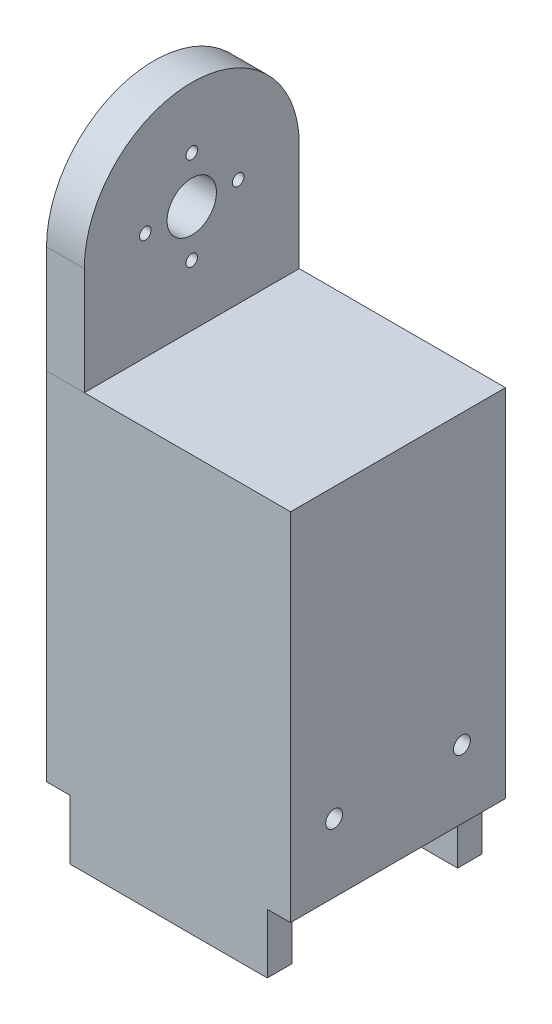
ISO-10303-21;
HEADER;
FILE_DESCRIPTION(('STEP AP214'),'2;1');
FILE_NAME('part.step','',(''),(''),'','','');
FILE_SCHEMA(('AUTOMOTIVE_DESIGN { 1 0 10303 214 1 1 1 1 }'));
ENDSEC;
DATA;
#1=APPLICATION_CONTEXT('core data for automotive mechanical design processes');
#2=APPLICATION_PROTOCOL_DEFINITION('international standard','automotive_design',2000,#1);
#3=PRODUCT_CONTEXT('',#1,'mechanical');
#4=PRODUCT('Part','Part','',(#3));
#5=PRODUCT_RELATED_PRODUCT_CATEGORY('part','',(#4));
#6=PRODUCT_DEFINITION_FORMATION('','',#4);
#7=PRODUCT_DEFINITION_CONTEXT('part definition',#1,'design');
#8=PRODUCT_DEFINITION('design','',#6,#7);
#9=PRODUCT_DEFINITION_SHAPE('','',#8);
#10=(LENGTH_UNIT() NAMED_UNIT(*) SI_UNIT(.MILLI.,.METRE.));
#11=(NAMED_UNIT(*) PLANE_ANGLE_UNIT() SI_UNIT($,.RADIAN.));
#12=(NAMED_UNIT(*) SI_UNIT($,.STERADIAN.) SOLID_ANGLE_UNIT());
#13=UNCERTAINTY_MEASURE_WITH_UNIT(LENGTH_MEASURE(1.E-05),#10,'distance_accuracy_value','');
#14=(GEOMETRIC_REPRESENTATION_CONTEXT(3) GLOBAL_UNCERTAINTY_ASSIGNED_CONTEXT((#13)) GLOBAL_UNIT_ASSIGNED_CONTEXT((#10,
#11,#12)) REPRESENTATION_CONTEXT('',''));
#15=CARTESIAN_POINT('',(0.,0.,0.));
#16=DIRECTION('',(0.,0.,1.));
#17=DIRECTION('',(1.,0.,0.));
#18=AXIS2_PLACEMENT_3D('',#15,#16,#17);
#19=CARTESIAN_POINT('',(-5.22083765373738,75.7060374898499,55.1424805889509));
#20=DIRECTION('',(1.,0.,0.));
#21=DIRECTION('',(0.,1.,0.));
#22=AXIS2_PLACEMENT_3D('',#19,#20,#21);
#23=CYLINDRICAL_SURFACE('',#22,1.);
#24=CARTESIAN_POINT('',(3.77916234626259,75.7060374898499,55.1424805889509));
#25=DIRECTION('',(1.,0.,0.));
#26=DIRECTION('',(0.,0.,-1.));
#27=AXIS2_PLACEMENT_3D('',#24,#25,#26);
#28=CIRCLE('',#27,1.);
#29=CARTESIAN_POINT('',(3.77916234626259,75.7060374898499,54.1424805889509));
#30=VERTEX_POINT('',#29);
#31=EDGE_CURVE('P0_E79',#30,#30,#28,.F.);
#32=ORIENTED_EDGE('',*,*,#31,.T.);
#33=EDGE_LOOP('',(#32));
#34=FACE_BOUND('',#33,.T.);
#35=CARTESIAN_POINT('',(10.2791623462627,75.7060374898499,55.1424805889509));
#36=DIRECTION('',(1.,0.,0.));
#37=DIRECTION('',(0.,1.,0.));
#38=AXIS2_PLACEMENT_3D('',#35,#36,#37);
#39=CIRCLE('',#38,1.);
#40=CARTESIAN_POINT('',(10.2791623462627,76.7060374898499,55.1424805889509));
#41=VERTEX_POINT('',#40);
#42=EDGE_CURVE('P0_E115',#41,#41,#39,.F.);
#43=ORIENTED_EDGE('',*,*,#42,.F.);
#44=EDGE_LOOP('',(#43));
#45=FACE_BOUND('',#44,.T.);
#46=ADVANCED_FACE('P0_F17',(#34,#45),#23,.F.);
#47=CARTESIAN_POINT('',(-5.22083765373738,59.7060374898499,55.1424805889507));
#48=DIRECTION('',(1.,0.,0.));
#49=DIRECTION('',(0.,1.,0.));
#50=AXIS2_PLACEMENT_3D('',#47,#48,#49);
#51=CYLINDRICAL_SURFACE('',#50,1.);
#52=CARTESIAN_POINT('',(3.77916234626259,59.7060374898499,55.1424805889507));
#53=DIRECTION('',(1.,0.,0.));
#54=DIRECTION('',(0.,0.,-1.));
#55=AXIS2_PLACEMENT_3D('',#52,#53,#54);
#56=CIRCLE('',#55,1.);
#57=CARTESIAN_POINT('',(3.77916234626259,59.7060374898499,54.1424805889507));
#58=VERTEX_POINT('',#57);
#59=EDGE_CURVE('P0_E89',#58,#58,#56,.F.);
#60=ORIENTED_EDGE('',*,*,#59,.T.);
#61=EDGE_LOOP('',(#60));
#62=FACE_BOUND('',#61,.T.);
#63=CARTESIAN_POINT('',(10.2791623462627,59.7060374898499,55.1424805889507));
#64=DIRECTION('',(1.,0.,0.));
#65=DIRECTION('',(0.,1.,0.));
#66=AXIS2_PLACEMENT_3D('',#63,#64,#65);
#67=CIRCLE('',#66,1.);
#68=CARTESIAN_POINT('',(10.2791623462627,60.7060374898499,55.1424805889507));
#69=VERTEX_POINT('',#68);
#70=EDGE_CURVE('P0_E112',#69,#69,#67,.F.);
#71=ORIENTED_EDGE('',*,*,#70,.F.);
#72=EDGE_LOOP('',(#71));
#73=FACE_BOUND('',#72,.T.);
#74=ADVANCED_FACE('P0_F19',(#62,#73),#51,.F.);
#75=CARTESIAN_POINT('',(-5.22083765373738,67.7060374898499,63.1424805889508));
#76=DIRECTION('',(1.,0.,0.));
#77=DIRECTION('',(0.,1.,0.));
#78=AXIS2_PLACEMENT_3D('',#75,#76,#77);
#79=CYLINDRICAL_SURFACE('',#78,1.);
#80=CARTESIAN_POINT('',(3.77916234626259,67.7060374898499,63.1424805889508));
#81=DIRECTION('',(1.,0.,0.));
#82=DIRECTION('',(0.,0.,-1.));
#83=AXIS2_PLACEMENT_3D('',#80,#81,#82);
#84=CIRCLE('',#83,1.);
#85=CARTESIAN_POINT('',(3.77916234626259,67.7060374898499,62.1424805889508));
#86=VERTEX_POINT('',#85);
#87=EDGE_CURVE('P0_E92',#86,#86,#84,.F.);
#88=ORIENTED_EDGE('',*,*,#87,.T.);
#89=EDGE_LOOP('',(#88));
#90=FACE_BOUND('',#89,.T.);
#91=CARTESIAN_POINT('',(10.2791623462627,67.7060374898499,63.1424805889508));
#92=DIRECTION('',(1.,0.,0.));
#93=DIRECTION('',(0.,1.,0.));
#94=AXIS2_PLACEMENT_3D('',#91,#92,#93);
#95=CIRCLE('',#94,1.);
#96=CARTESIAN_POINT('',(10.2791623462627,68.7060374898499,63.1424805889508));
#97=VERTEX_POINT('',#96);
#98=EDGE_CURVE('P0_E109',#97,#97,#95,.F.);
#99=ORIENTED_EDGE('',*,*,#98,.F.);
#100=EDGE_LOOP('',(#99));
#101=FACE_BOUND('',#100,.T.);
#102=ADVANCED_FACE('P0_F128',(#90,#101),#79,.F.);
#103=CARTESIAN_POINT('',(-5.22083765373738,67.7060374898499,55.1424805889509));
#104=DIRECTION('',(1.,0.,0.));
#105=DIRECTION('',(0.,1.,0.));
#106=AXIS2_PLACEMENT_3D('',#103,#104,#105);
#107=CYLINDRICAL_SURFACE('',#106,4.25);
#108=CARTESIAN_POINT('',(3.77916234626259,67.7060374898499,55.1424805889509));
#109=DIRECTION('',(1.,0.,0.));
#110=DIRECTION('',(0.,0.,-1.));
#111=AXIS2_PLACEMENT_3D('',#108,#109,#110);
#112=CIRCLE('',#111,4.25);
#113=CARTESIAN_POINT('',(3.77916234626259,67.7060374898499,50.8924805889509));
#114=VERTEX_POINT('',#113);
#115=EDGE_CURVE('P0_E75',#114,#114,#112,.F.);
#116=ORIENTED_EDGE('',*,*,#115,.T.);
#117=EDGE_LOOP('',(#116));
#118=FACE_BOUND('',#117,.T.);
#119=CARTESIAN_POINT('',(10.2791623462627,67.7060374898499,55.1424805889509));
#120=DIRECTION('',(1.,0.,0.));
#121=DIRECTION('',(0.,1.,0.));
#122=AXIS2_PLACEMENT_3D('',#119,#120,#121);
#123=CIRCLE('',#122,4.25);
#124=CARTESIAN_POINT('',(10.2791623462627,71.9560374898499,55.1424805889509));
#125=VERTEX_POINT('',#124);
#126=EDGE_CURVE('P0_E106',#125,#125,#123,.F.);
#127=ORIENTED_EDGE('',*,*,#126,.F.);
#128=EDGE_LOOP('',(#127));
#129=FACE_BOUND('',#128,.T.);
#130=ADVANCED_FACE('P0_F137',(#118,#129),#107,.F.);
#131=CARTESIAN_POINT('',(-5.22083765373738,67.70603748985,47.1424805889508));
#132=DIRECTION('',(1.,0.,0.));
#133=DIRECTION('',(0.,1.,0.));
#134=AXIS2_PLACEMENT_3D('',#131,#132,#133);
#135=CYLINDRICAL_SURFACE('',#134,1.);
#136=CARTESIAN_POINT('',(3.77916234626259,67.70603748985,47.1424805889508));
#137=DIRECTION('',(1.,0.,0.));
#138=DIRECTION('',(0.,0.,-1.));
#139=AXIS2_PLACEMENT_3D('',#136,#137,#138);
#140=CIRCLE('',#139,1.);
#141=CARTESIAN_POINT('',(3.77916234626259,67.70603748985,46.1424805889508));
#142=VERTEX_POINT('',#141);
#143=EDGE_CURVE('P0_E86',#142,#142,#140,.F.);
#144=ORIENTED_EDGE('',*,*,#143,.T.);
#145=EDGE_LOOP('',(#144));
#146=FACE_BOUND('',#145,.T.);
#147=CARTESIAN_POINT('',(10.2791623462627,67.70603748985,47.1424805889508));
#148=DIRECTION('',(1.,0.,0.));
#149=DIRECTION('',(0.,1.,0.));
#150=AXIS2_PLACEMENT_3D('',#147,#148,#149);
#151=CIRCLE('',#150,1.);
#152=CARTESIAN_POINT('',(10.2791623462627,68.70603748985,47.1424805889508));
#153=VERTEX_POINT('',#152);
#154=EDGE_CURVE('P0_E103',#153,#153,#151,.F.);
#155=ORIENTED_EDGE('',*,*,#154,.F.);
#156=EDGE_LOOP('',(#155));
#157=FACE_BOUND('',#156,.T.);
#158=ADVANCED_FACE('P0_F134',(#146,#157),#135,.F.);
#159=CARTESIAN_POINT('',(-0.220837653737416,67.7060374898499,55.1424805889509));
#160=DIRECTION('',(1.,0.,0.));
#161=DIRECTION('',(0.,1.,0.));
#162=AXIS2_PLACEMENT_3D('',#159,#160,#161);
#163=CYLINDRICAL_SURFACE('',#162,18.5);
#164=DIRECTION('',(1.,0.,0.));
#165=VECTOR('',#164,1.);
#166=CARTESIAN_POINT('',(-0.220837653737416,67.7060374898499,36.6424805889509));
#167=LINE('',#166,#165);
#168=CARTESIAN_POINT('',(3.77916234626259,67.7060374898499,36.6424805889509));
#169=VERTEX_POINT('',#168);
#170=CARTESIAN_POINT('',(10.2791623462627,67.7060374898499,36.6424805889509));
#171=VERTEX_POINT('',#170);
#172=EDGE_CURVE('P0_E21',#169,#171,#167,.T.);
#173=ORIENTED_EDGE('',*,*,#172,.F.);
#174=CARTESIAN_POINT('',(3.77916234626259,67.7060374898499,55.1424805889509));
#175=DIRECTION('',(1.,0.,0.));
#176=DIRECTION('',(0.,0.,-1.));
#177=AXIS2_PLACEMENT_3D('',#174,#175,#176);
#178=CIRCLE('',#177,18.5);
#179=CARTESIAN_POINT('',(3.77916234626259,67.7060374898499,73.6424805889509));
#180=VERTEX_POINT('',#179);
#181=EDGE_CURVE('P0_E76',#180,#169,#178,.F.);
#182=ORIENTED_EDGE('',*,*,#181,.F.);
#183=DIRECTION('',(1.,0.,0.));
#184=VECTOR('',#183,1.);
#185=CARTESIAN_POINT('',(-0.220837653737416,67.7060374898499,73.6424805889509));
#186=LINE('',#185,#184);
#187=CARTESIAN_POINT('',(10.2791623462627,67.7060374898499,73.6424805889509));
#188=VERTEX_POINT('',#187);
#189=EDGE_CURVE('P0_E11',#180,#188,#186,.T.);
#190=ORIENTED_EDGE('',*,*,#189,.T.);
#191=CARTESIAN_POINT('',(10.2791623462627,67.7060374898499,55.1424805889509));
#192=DIRECTION('',(1.,0.,0.));
#193=DIRECTION('',(0.,1.,0.));
#194=AXIS2_PLACEMENT_3D('',#191,#192,#193);
#195=CIRCLE('',#194,18.5);
#196=EDGE_CURVE('P0_E95',#171,#188,#195,.T.);
#197=ORIENTED_EDGE('',*,*,#196,.F.);
#198=EDGE_LOOP('',(#173,#182,#190,#197));
#199=FACE_BOUND('',#198,.T.);
#200=ADVANCED_FACE('P0_F132',(#199),#163,.T.);
#201=CARTESIAN_POINT('',(3.77916234626259,-67.0439625101501,27.6424805889509));
#202=DIRECTION('',(1.,0.,0.));
#203=DIRECTION('',(0.,0.,-1.));
#204=AXIS2_PLACEMENT_3D('',#201,#202,#203);
#205=PLANE('',#204);
#206=ORIENTED_EDGE('',*,*,#87,.F.);
#207=EDGE_LOOP('',(#206));
#208=FACE_BOUND('',#207,.T.);
#209=ORIENTED_EDGE('',*,*,#143,.F.);
#210=EDGE_LOOP('',(#209));
#211=FACE_BOUND('',#210,.T.);
#212=ORIENTED_EDGE('',*,*,#115,.F.);
#213=EDGE_LOOP('',(#212));
#214=FACE_BOUND('',#213,.T.);
#215=ORIENTED_EDGE('',*,*,#31,.F.);
#216=EDGE_LOOP('',(#215));
#217=FACE_BOUND('',#216,.T.);
#218=ORIENTED_EDGE('',*,*,#59,.F.);
#219=EDGE_LOOP('',(#218));
#220=FACE_BOUND('',#219,.T.);
#221=DIRECTION('',(0.,1.,0.));
#222=VECTOR('',#221,1.);
#223=CARTESIAN_POINT('',(3.77916234626259,92.70603748985,36.6424805889509));
#224=LINE('',#223,#222);
#225=CARTESIAN_POINT('',(3.77916234626259,49.20603748985,36.6424805889509));
#226=VERTEX_POINT('',#225);
#227=EDGE_CURVE('P0_E71',#226,#169,#224,.T.);
#228=ORIENTED_EDGE('',*,*,#227,.F.);
#229=DIRECTION('',(0.,0.,-1.));
#230=VECTOR('',#229,1.);
#231=CARTESIAN_POINT('',(3.77916234626259,49.20603748985,36.6424805889509));
#232=LINE('',#231,#230);
#233=CARTESIAN_POINT('',(3.77916234626259,49.20603748985,73.6424805889509));
#234=VERTEX_POINT('',#233);
#235=EDGE_CURVE('P0_E58',#234,#226,#232,.T.);
#236=ORIENTED_EDGE('',*,*,#235,.F.);
#237=DIRECTION('',(0.,1.,0.));
#238=VECTOR('',#237,1.);
#239=CARTESIAN_POINT('',(3.77916234626259,92.70603748985,73.6424805889509));
#240=LINE('',#239,#238);
#241=EDGE_CURVE('P0_E69',#234,#180,#240,.T.);
#242=ORIENTED_EDGE('',*,*,#241,.T.);
#243=ORIENTED_EDGE('',*,*,#181,.T.);
#244=EDGE_LOOP('',(#228,#236,#242,#243));
#245=FACE_BOUND('',#244,.T.);
#246=ADVANCED_FACE('P0_F67',(#208,#211,#214,#217,#220,#245),#205,.F.);
#247=CARTESIAN_POINT('',(10.2791623462627,92.70603748985,82.6424805889509));
#248=DIRECTION('',(1.,0.,0.));
#249=DIRECTION('',(0.,1.,0.));
#250=AXIS2_PLACEMENT_3D('',#247,#248,#249);
#251=PLANE('',#250);
#252=ORIENTED_EDGE('',*,*,#196,.T.);
#253=DIRECTION('',(0.,-1.,0.));
#254=VECTOR('',#253,1.);
#255=CARTESIAN_POINT('',(10.2791623462627,92.70603748985,73.6424805889509));
#256=LINE('',#255,#254);
#257=CARTESIAN_POINT('',(10.2791623462626,49.20603748985,73.6424805889509));
#258=VERTEX_POINT('',#257);
#259=EDGE_CURVE('P0_E98',#188,#258,#256,.T.);
#260=ORIENTED_EDGE('',*,*,#259,.T.);
#261=DIRECTION('',(0.,0.,-1.));
#262=VECTOR('',#261,1.);
#263=CARTESIAN_POINT('',(10.2791623462627,49.20603748985,82.6424805889509));
#264=LINE('',#263,#262);
#265=CARTESIAN_POINT('',(10.2791623462627,49.20603748985,36.6424805889509));
#266=VERTEX_POINT('',#265);
#267=EDGE_CURVE('P0_E59',#258,#266,#264,.T.);
#268=ORIENTED_EDGE('',*,*,#267,.T.);
#269=DIRECTION('',(0.,1.,0.));
#270=VECTOR('',#269,1.);
#271=CARTESIAN_POINT('',(10.2791623462627,92.70603748985,36.6424805889509));
#272=LINE('',#271,#270);
#273=EDGE_CURVE('P0_E101',#266,#171,#272,.T.);
#274=ORIENTED_EDGE('',*,*,#273,.T.);
#275=EDGE_LOOP('',(#252,#260,#268,#274));
#276=FACE_BOUND('',#275,.T.);
#277=ORIENTED_EDGE('',*,*,#154,.T.);
#278=EDGE_LOOP('',(#277));
#279=FACE_BOUND('',#278,.T.);
#280=ORIENTED_EDGE('',*,*,#126,.T.);
#281=EDGE_LOOP('',(#280));
#282=FACE_BOUND('',#281,.T.);
#283=ORIENTED_EDGE('',*,*,#98,.T.);
#284=EDGE_LOOP('',(#283));
#285=FACE_BOUND('',#284,.T.);
#286=ORIENTED_EDGE('',*,*,#70,.T.);
#287=EDGE_LOOP('',(#286));
#288=FACE_BOUND('',#287,.T.);
#289=ORIENTED_EDGE('',*,*,#42,.T.);
#290=EDGE_LOOP('',(#289));
#291=FACE_BOUND('',#290,.T.);
#292=ADVANCED_FACE('P0_F119',(#276,#279,#282,#285,#288,#291),#251,.T.);
#293=CARTESIAN_POINT('',(-0.220837653737416,92.70603748985,36.6424805889509));
#294=DIRECTION('',(0.,0.,1.));
#295=DIRECTION('',(1.,0.,0.));
#296=AXIS2_PLACEMENT_3D('',#293,#294,#295);
#297=PLANE('',#296);
#298=ORIENTED_EDGE('',*,*,#273,.F.);
#299=DIRECTION('',(-1.,0.,0.));
#300=VECTOR('',#299,1.);
#301=CARTESIAN_POINT('',(45.7791623462626,49.20603748985,36.6424805889509));
#302=LINE('',#301,#300);
#303=EDGE_CURVE('P0_E39',#266,#226,#302,.T.);
#304=ORIENTED_EDGE('',*,*,#303,.T.);
#305=ORIENTED_EDGE('',*,*,#227,.T.);
#306=ORIENTED_EDGE('',*,*,#172,.T.);
#307=EDGE_LOOP('',(#298,#304,#305,#306));
#308=FACE_BOUND('',#307,.T.);
#309=ADVANCED_FACE('P0_F151',(#308),#297,.F.);
#310=CARTESIAN_POINT('',(-0.220837653737416,92.70603748985,73.6424805889509));
#311=DIRECTION('',(0.,0.,1.));
#312=DIRECTION('',(1.,0.,0.));
#313=AXIS2_PLACEMENT_3D('',#310,#311,#312);
#314=PLANE('',#313);
#315=DIRECTION('',(-1.,0.,0.));
#316=VECTOR('',#315,1.);
#317=CARTESIAN_POINT('',(45.7791623462626,49.20603748985,73.6424805889509));
#318=LINE('',#317,#316);
#319=EDGE_CURVE('P0_E55',#258,#234,#318,.T.);
#320=ORIENTED_EDGE('',*,*,#319,.F.);
#321=ORIENTED_EDGE('',*,*,#259,.F.);
#322=ORIENTED_EDGE('',*,*,#189,.F.);
#323=ORIENTED_EDGE('',*,*,#241,.F.);
#324=EDGE_LOOP('',(#320,#321,#322,#323));
#325=FACE_BOUND('',#324,.T.);
#326=ADVANCED_FACE('P0_F74',(#325),#314,.T.);
#327=CARTESIAN_POINT('',(45.7791623462626,49.20603748985,36.6424805889509));
#328=DIRECTION('',(0.,1.,0.));
#329=DIRECTION('',(0.,0.,1.));
#330=AXIS2_PLACEMENT_3D('',#327,#328,#329);
#331=PLANE('',#330);
#332=ORIENTED_EDGE('',*,*,#319,.T.);
#333=ORIENTED_EDGE('',*,*,#235,.T.);
#334=ORIENTED_EDGE('',*,*,#303,.F.);
#335=ORIENTED_EDGE('',*,*,#267,.F.);
#336=EDGE_LOOP('',(#332,#333,#334,#335));
#337=FACE_BOUND('',#336,.T.);
#338=ADVANCED_FACE('P0_F57',(#337),#331,.F.);
#339=CLOSED_SHELL('',(#46,#74,#102,#130,#158,#200,#246,#292,#309,#326,#338));
#340=MANIFOLD_SOLID_BREP('P0_B1',#339);
#341=CARTESIAN_POINT('',(7.77916234626263,147.70603748985,27.6424805889509));
#342=DIRECTION('',(1.,0.,0.));
#343=DIRECTION('',(0.,1.,0.));
#344=AXIS2_PLACEMENT_3D('',#341,#342,#343);
#345=PLANE('',#344);
#346=DIRECTION('',(0.,0.,1.));
#347=VECTOR('',#346,1.);
#348=CARTESIAN_POINT('',(7.77916234626261,2.95603748984996,27.6424805889509));
#349=LINE('',#348,#347);
#350=CARTESIAN_POINT('',(7.77916234626259,2.95603748984996,40.8924805889509));
#351=VERTEX_POINT('',#350);
#352=CARTESIAN_POINT('',(7.77916234626261,2.95603748984996,69.3924805889509));
#353=VERTEX_POINT('',#352);
#354=EDGE_CURVE('P1_E270',#351,#353,#349,.T.);
#355=ORIENTED_EDGE('',*,*,#354,.T.);
#356=DIRECTION('',(0.,1.,0.));
#357=VECTOR('',#356,1.);
#358=CARTESIAN_POINT('',(7.77916234626261,-22.0439625101501,69.3924805889509));
#359=LINE('',#358,#357);
#360=CARTESIAN_POINT('',(7.77916234626259,-12.0439625101501,69.3924805889509));
#361=VERTEX_POINT('',#360);
#362=EDGE_CURVE('P1_E286',#361,#353,#359,.T.);
#363=ORIENTED_EDGE('',*,*,#362,.F.);
#364=DIRECTION('',(0.,0.,1.));
#365=VECTOR('',#364,1.);
#366=CARTESIAN_POINT('',(7.77916234626259,-12.0439625101501,27.6424805889509));
#367=LINE('',#366,#365);
#368=CARTESIAN_POINT('',(7.77916234626259,-12.0439625101501,40.8924805889509));
#369=VERTEX_POINT('',#368);
#370=EDGE_CURVE('P1_E246',#369,#361,#367,.T.);
#371=ORIENTED_EDGE('',*,*,#370,.F.);
#372=DIRECTION('',(0.,1.,0.));
#373=VECTOR('',#372,1.);
#374=CARTESIAN_POINT('',(7.77916234626261,-22.0439625101501,40.8924805889509));
#375=LINE('',#374,#373);
#376=EDGE_CURVE('P1_E263',#369,#351,#375,.T.);
#377=ORIENTED_EDGE('',*,*,#376,.T.);
#378=EDGE_LOOP('',(#355,#363,#371,#377));
#379=FACE_BOUND('',#378,.T.);
#380=CARTESIAN_POINT('',(7.7791623462626,-0.293962510150042,66.1424805889509));
#381=DIRECTION('',(1.,0.,0.));
#382=DIRECTION('',(0.,0.,-1.));
#383=AXIS2_PLACEMENT_3D('',#380,#381,#382);
#384=CIRCLE('',#383,1.45);
#385=CARTESIAN_POINT('',(7.7791623462626,-0.293962510150042,64.6924805889509));
#386=VERTEX_POINT('',#385);
#387=EDGE_CURVE('P1_E167',#386,#386,#384,.T.);
#388=ORIENTED_EDGE('',*,*,#387,.F.);
#389=EDGE_LOOP('',(#388));
#390=FACE_BOUND('',#389,.T.);
#391=CARTESIAN_POINT('',(7.7791623462626,-0.293962510150042,44.1424805889509));
#392=DIRECTION('',(1.,0.,0.));
#393=DIRECTION('',(0.,0.,-1.));
#394=AXIS2_PLACEMENT_3D('',#391,#392,#393);
#395=CIRCLE('',#394,1.45);
#396=CARTESIAN_POINT('',(7.7791623462626,-0.293962510150042,42.6924805889509));
#397=VERTEX_POINT('',#396);
#398=EDGE_CURVE('P1_E176',#397,#397,#395,.T.);
#399=ORIENTED_EDGE('',*,*,#398,.F.);
#400=EDGE_LOOP('',(#399));
#401=FACE_BOUND('',#400,.T.);
#402=ADVANCED_FACE('P1_F17',(#379,#390,#401),#345,.T.);
#403=CARTESIAN_POINT('',(24.7791623462626,2.95603748984996,27.6424805889509));
#404=DIRECTION('',(0.,1.,0.));
#405=DIRECTION('',(0.,0.,1.));
#406=AXIS2_PLACEMENT_3D('',#403,#404,#405);
#407=PLANE('',#406);
#408=DIRECTION('',(-1.,0.,0.));
#409=VECTOR('',#408,1.);
#410=CARTESIAN_POINT('',(7.77916234626261,2.95603748984996,40.8924805889509));
#411=LINE('',#410,#409);
#412=CARTESIAN_POINT('',(41.7791623462626,2.95603748984996,40.8924805889509));
#413=VERTEX_POINT('',#412);
#414=EDGE_CURVE('P1_E294',#413,#351,#411,.T.);
#415=ORIENTED_EDGE('',*,*,#414,.F.);
#416=DIRECTION('',(0.,0.,1.));
#417=VECTOR('',#416,1.);
#418=CARTESIAN_POINT('',(41.7791623462626,2.95603748984996,27.6424805889509));
#419=LINE('',#418,#417);
#420=CARTESIAN_POINT('',(41.7791623462626,2.95603748984996,69.3924805889509));
#421=VERTEX_POINT('',#420);
#422=EDGE_CURVE('P1_E269',#413,#421,#419,.T.);
#423=ORIENTED_EDGE('',*,*,#422,.T.);
#424=DIRECTION('',(1.,0.,0.));
#425=VECTOR('',#424,1.);
#426=CARTESIAN_POINT('',(7.77916234626261,2.95603748984996,69.3924805889509));
#427=LINE('',#426,#425);
#428=EDGE_CURVE('P1_E163',#353,#421,#427,.T.);
#429=ORIENTED_EDGE('',*,*,#428,.F.);
#430=ORIENTED_EDGE('',*,*,#354,.F.);
#431=EDGE_LOOP('',(#415,#423,#429,#430));
#432=FACE_BOUND('',#431,.T.);
#433=ADVANCED_FACE('P1_F310',(#432),#407,.F.);
#434=CARTESIAN_POINT('',(41.7791623462626,147.70603748985,27.6424805889509));
#435=DIRECTION('',(1.,0.,0.));
#436=DIRECTION('',(0.,0.,-1.));
#437=AXIS2_PLACEMENT_3D('',#434,#435,#436);
#438=PLANE('',#437);
#439=DIRECTION('',(0.,1.,0.));
#440=VECTOR('',#439,1.);
#441=CARTESIAN_POINT('',(41.7791623462626,-22.0439625101501,69.3924805889509));
#442=LINE('',#441,#440);
#443=CARTESIAN_POINT('',(41.7791623462626,-12.0439625101501,69.3924805889509));
#444=VERTEX_POINT('',#443);
#445=EDGE_CURVE('P1_E276',#444,#421,#442,.T.);
#446=ORIENTED_EDGE('',*,*,#445,.T.);
#447=ORIENTED_EDGE('',*,*,#422,.F.);
#448=DIRECTION('',(0.,1.,0.));
#449=VECTOR('',#448,1.);
#450=CARTESIAN_POINT('',(41.7791623462626,-22.0439625101501,40.8924805889509));
#451=LINE('',#450,#449);
#452=CARTESIAN_POINT('',(41.7791623462626,-12.0439625101501,40.8924805889509));
#453=VERTEX_POINT('',#452);
#454=EDGE_CURVE('P1_E291',#453,#413,#451,.T.);
#455=ORIENTED_EDGE('',*,*,#454,.F.);
#456=DIRECTION('',(0.,0.,1.));
#457=VECTOR('',#456,1.);
#458=CARTESIAN_POINT('',(41.7791623462626,-12.0439625101501,27.6424805889509));
#459=LINE('',#458,#457);
#460=EDGE_CURVE('P1_E159',#453,#444,#459,.T.);
#461=ORIENTED_EDGE('',*,*,#460,.T.);
#462=EDGE_LOOP('',(#446,#447,#455,#461));
#463=FACE_BOUND('',#462,.T.);
#464=CARTESIAN_POINT('',(41.7791623462626,-0.293962510150042,66.1424805889509));
#465=DIRECTION('',(1.,0.,0.));
#466=DIRECTION('',(0.,0.,-1.));
#467=AXIS2_PLACEMENT_3D('',#464,#465,#466);
#468=CIRCLE('',#467,1.45);
#469=CARTESIAN_POINT('',(41.7791623462626,-0.293962510150042,64.6924805889509));
#470=VERTEX_POINT('',#469);
#471=EDGE_CURVE('P1_E154',#470,#470,#468,.T.);
#472=ORIENTED_EDGE('',*,*,#471,.T.);
#473=EDGE_LOOP('',(#472));
#474=FACE_BOUND('',#473,.T.);
#475=CARTESIAN_POINT('',(41.7791623462626,-0.293962510150042,44.1424805889509));
#476=DIRECTION('',(1.,0.,0.));
#477=DIRECTION('',(0.,0.,-1.));
#478=AXIS2_PLACEMENT_3D('',#475,#476,#477);
#479=CIRCLE('',#478,1.45);
#480=CARTESIAN_POINT('',(41.7791623462626,-0.293962510150042,42.6924805889509));
#481=VERTEX_POINT('',#480);
#482=EDGE_CURVE('P1_E158',#481,#481,#479,.T.);
#483=ORIENTED_EDGE('',*,*,#482,.T.);
#484=EDGE_LOOP('',(#483));
#485=FACE_BOUND('',#484,.T.);
#486=ADVANCED_FACE('P1_F316',(#463,#474,#485),#438,.F.);
#487=CARTESIAN_POINT('',(7.77916234626261,-22.0439625101501,69.3924805889509));
#488=DIRECTION('',(0.,0.,1.));
#489=DIRECTION('',(1.,0.,0.));
#490=AXIS2_PLACEMENT_3D('',#487,#488,#489);
#491=PLANE('',#490);
#492=ORIENTED_EDGE('',*,*,#428,.T.);
#493=ORIENTED_EDGE('',*,*,#445,.F.);
#494=CARTESIAN_POINT('',(41.7791623462626,-22.2939625101501,69.3924805889509));
#495=VERTEX_POINT('',#494);
#496=EDGE_CURVE('P1_E287',#495,#444,#442,.T.);
#497=ORIENTED_EDGE('',*,*,#496,.F.);
#498=DIRECTION('',(1.,0.,0.));
#499=VECTOR('',#498,1.);
#500=CARTESIAN_POINT('',(24.7791623462626,-22.2939625101501,69.3924805889509));
#501=LINE('',#500,#499);
#502=CARTESIAN_POINT('',(7.77916234626259,-22.2939625101501,69.3924805889509));
#503=VERTEX_POINT('',#502);
#504=EDGE_CURVE('P1_E249',#503,#495,#501,.T.);
#505=ORIENTED_EDGE('',*,*,#504,.F.);
#506=EDGE_CURVE('P1_E282',#503,#361,#359,.T.);
#507=ORIENTED_EDGE('',*,*,#506,.T.);
#508=ORIENTED_EDGE('',*,*,#362,.T.);
#509=EDGE_LOOP('',(#492,#493,#497,#505,#507,#508));
#510=FACE_BOUND('',#509,.T.);
#511=ADVANCED_FACE('P1_F306',(#510),#491,.F.);
#512=CARTESIAN_POINT('',(7.77916234626261,-22.0439625101501,40.8924805889509));
#513=DIRECTION('',(0.,0.,-1.));
#514=DIRECTION('',(-1.,0.,0.));
#515=AXIS2_PLACEMENT_3D('',#512,#513,#514);
#516=PLANE('',#515);
#517=ORIENTED_EDGE('',*,*,#414,.T.);
#518=ORIENTED_EDGE('',*,*,#376,.F.);
#519=CARTESIAN_POINT('',(7.77916234626259,-22.2939625101501,40.8924805889509));
#520=VERTEX_POINT('',#519);
#521=EDGE_CURVE('P1_E222',#520,#369,#375,.T.);
#522=ORIENTED_EDGE('',*,*,#521,.F.);
#523=DIRECTION('',(1.,0.,0.));
#524=VECTOR('',#523,1.);
#525=CARTESIAN_POINT('',(24.7791623462626,-22.2939625101501,40.8924805889509));
#526=LINE('',#525,#524);
#527=CARTESIAN_POINT('',(41.7791623462626,-22.2939625101501,40.8924805889509));
#528=VERTEX_POINT('',#527);
#529=EDGE_CURVE('P1_E296',#520,#528,#526,.T.);
#530=ORIENTED_EDGE('',*,*,#529,.T.);
#531=EDGE_CURVE('P1_E302',#528,#453,#451,.T.);
#532=ORIENTED_EDGE('',*,*,#531,.T.);
#533=ORIENTED_EDGE('',*,*,#454,.T.);
#534=EDGE_LOOP('',(#517,#518,#522,#530,#532,#533));
#535=FACE_BOUND('',#534,.T.);
#536=ADVANCED_FACE('P1_F332',(#535),#516,.F.);
#537=CARTESIAN_POINT('',(41.7791623462626,147.70603748985,82.6424805889509));
#538=DIRECTION('',(1.,0.,0.));
#539=DIRECTION('',(0.,1.,0.));
#540=AXIS2_PLACEMENT_3D('',#537,#538,#539);
#541=PLANE('',#540);
#542=DIRECTION('',(0.,1.,0.));
#543=VECTOR('',#542,1.);
#544=CARTESIAN_POINT('',(41.7791623462626,147.70603748985,73.6424805889509));
#545=LINE('',#544,#543);
#546=CARTESIAN_POINT('',(41.7791623462626,-22.2939625101501,73.6424805889509));
#547=VERTEX_POINT('',#546);
#548=CARTESIAN_POINT('',(41.7791623462626,-12.0439625101501,73.6424805889509));
#549=VERTEX_POINT('',#548);
#550=EDGE_CURVE('P1_E151',#547,#549,#545,.T.);
#551=ORIENTED_EDGE('',*,*,#550,.F.);
#552=DIRECTION('',(0.,0.,1.));
#553=VECTOR('',#552,1.);
#554=CARTESIAN_POINT('',(41.7791623462626,-22.2939625101501,69.3924805889509));
#555=LINE('',#554,#553);
#556=EDGE_CURVE('P1_E255',#495,#547,#555,.T.);
#557=ORIENTED_EDGE('',*,*,#556,.F.);
#558=ORIENTED_EDGE('',*,*,#496,.T.);
#559=EDGE_CURVE('P1_E290',#444,#549,#459,.T.);
#560=ORIENTED_EDGE('',*,*,#559,.T.);
#561=EDGE_LOOP('',(#551,#557,#558,#560));
#562=FACE_BOUND('',#561,.T.);
#563=ADVANCED_FACE('P1_F326',(#562),#541,.T.);
#564=DIRECTION('',(0.,-1.,0.));
#565=VECTOR('',#564,1.);
#566=CARTESIAN_POINT('',(41.7791623462626,147.70603748985,36.6424805889509));
#567=LINE('',#566,#565);
#568=CARTESIAN_POINT('',(41.7791623462626,-12.0439625101501,36.6424805889509));
#569=VERTEX_POINT('',#568);
#570=CARTESIAN_POINT('',(41.7791623462626,-22.2939625101501,36.6424805889509));
#571=VERTEX_POINT('',#570);
#572=EDGE_CURVE('P1_E204',#569,#571,#567,.T.);
#573=ORIENTED_EDGE('',*,*,#572,.F.);
#574=EDGE_CURVE('P1_E321',#569,#453,#459,.T.);
#575=ORIENTED_EDGE('',*,*,#574,.T.);
#576=ORIENTED_EDGE('',*,*,#531,.F.);
#577=DIRECTION('',(0.,0.,-1.));
#578=VECTOR('',#577,1.);
#579=CARTESIAN_POINT('',(41.7791623462626,-22.2939625101501,40.8924805889509));
#580=LINE('',#579,#578);
#581=EDGE_CURVE('P1_E229',#528,#571,#580,.T.);
#582=ORIENTED_EDGE('',*,*,#581,.T.);
#583=EDGE_LOOP('',(#573,#575,#576,#582));
#584=FACE_BOUND('',#583,.T.);
#585=ADVANCED_FACE('P1_F340',(#584),#541,.T.);
#586=CARTESIAN_POINT('',(41.7791623462626,-12.0439625101501,27.6424805889509));
#587=DIRECTION('',(0.,1.,0.));
#588=DIRECTION('',(-1.,0.,0.));
#589=AXIS2_PLACEMENT_3D('',#586,#587,#588);
#590=PLANE('',#589);
#591=DIRECTION('',(0.,0.,1.));
#592=VECTOR('',#591,1.);
#593=CARTESIAN_POINT('',(45.7791623462626,-12.0439625101501,27.6424805889509));
#594=LINE('',#593,#592);
#595=CARTESIAN_POINT('',(45.7791623462626,-12.0439625101501,36.6424805889509));
#596=VERTEX_POINT('',#595);
#597=CARTESIAN_POINT('',(45.7791623462626,-12.0439625101501,73.6424805889509));
#598=VERTEX_POINT('',#597);
#599=EDGE_CURVE('P1_E224',#596,#598,#594,.T.);
#600=ORIENTED_EDGE('',*,*,#599,.T.);
#601=DIRECTION('',(-1.,0.,0.));
#602=VECTOR('',#601,1.);
#603=CARTESIAN_POINT('',(41.7791623462626,-12.0439625101501,73.6424805889509));
#604=LINE('',#603,#602);
#605=EDGE_CURVE('P1_E136',#598,#549,#604,.T.);
#606=ORIENTED_EDGE('',*,*,#605,.T.);
#607=ORIENTED_EDGE('',*,*,#559,.F.);
#608=ORIENTED_EDGE('',*,*,#460,.F.);
#609=ORIENTED_EDGE('',*,*,#574,.F.);
#610=DIRECTION('',(1.,0.,0.));
#611=VECTOR('',#610,1.);
#612=CARTESIAN_POINT('',(41.7791623462626,-12.0439625101501,36.6424805889509));
#613=LINE('',#612,#611);
#614=EDGE_CURVE('P1_E213',#569,#596,#613,.T.);
#615=ORIENTED_EDGE('',*,*,#614,.T.);
#616=EDGE_LOOP('',(#600,#606,#607,#608,#609,#615));
#617=FACE_BOUND('',#616,.T.);
#618=ADVANCED_FACE('P1_F329',(#617),#590,.F.);
#619=CARTESIAN_POINT('',(7.77916234626265,147.70603748985,82.6424805889509));
#620=DIRECTION('',(-1.,0.,0.));
#621=DIRECTION('',(0.,1.,0.));
#622=AXIS2_PLACEMENT_3D('',#619,#620,#621);
#623=PLANE('',#622);
#624=DIRECTION('',(0.,-1.,0.));
#625=VECTOR('',#624,1.);
#626=CARTESIAN_POINT('',(7.77916234626265,147.70603748985,73.6424805889509));
#627=LINE('',#626,#625);
#628=CARTESIAN_POINT('',(7.77916234626259,-12.0439625101501,73.6424805889509));
#629=VERTEX_POINT('',#628);
#630=CARTESIAN_POINT('',(7.77916234626259,-22.2939625101501,73.6424805889509));
#631=VERTEX_POINT('',#630);
#632=EDGE_CURVE('P1_E152',#629,#631,#627,.T.);
#633=ORIENTED_EDGE('',*,*,#632,.F.);
#634=EDGE_CURVE('P1_E241',#361,#629,#367,.T.);
#635=ORIENTED_EDGE('',*,*,#634,.F.);
#636=ORIENTED_EDGE('',*,*,#506,.F.);
#637=DIRECTION('',(0.,0.,1.));
#638=VECTOR('',#637,1.);
#639=CARTESIAN_POINT('',(7.77916234626259,-22.2939625101501,69.3924805889509));
#640=LINE('',#639,#638);
#641=EDGE_CURVE('P1_E216',#503,#631,#640,.T.);
#642=ORIENTED_EDGE('',*,*,#641,.T.);
#643=EDGE_LOOP('',(#633,#635,#636,#642));
#644=FACE_BOUND('',#643,.T.);
#645=ADVANCED_FACE('P1_F240',(#644),#623,.T.);
#646=DIRECTION('',(0.,1.,0.));
#647=VECTOR('',#646,1.);
#648=CARTESIAN_POINT('',(7.77916234626265,147.70603748985,36.6424805889509));
#649=LINE('',#648,#647);
#650=CARTESIAN_POINT('',(7.77916234626259,-22.2939625101501,36.6424805889509));
#651=VERTEX_POINT('',#650);
#652=CARTESIAN_POINT('',(7.77916234626259,-12.0439625101501,36.6424805889509));
#653=VERTEX_POINT('',#652);
#654=EDGE_CURVE('P1_E193',#651,#653,#649,.T.);
#655=ORIENTED_EDGE('',*,*,#654,.F.);
#656=DIRECTION('',(0.,0.,-1.));
#657=VECTOR('',#656,1.);
#658=CARTESIAN_POINT('',(7.77916234626259,-22.2939625101501,40.8924805889509));
#659=LINE('',#658,#657);
#660=EDGE_CURVE('P1_E122',#520,#651,#659,.T.);
#661=ORIENTED_EDGE('',*,*,#660,.F.);
#662=ORIENTED_EDGE('',*,*,#521,.T.);
#663=EDGE_CURVE('P1_E251',#653,#369,#367,.T.);
#664=ORIENTED_EDGE('',*,*,#663,.F.);
#665=EDGE_LOOP('',(#655,#661,#662,#664));
#666=FACE_BOUND('',#665,.T.);
#667=ADVANCED_FACE('P1_F356',(#666),#623,.T.);
#668=CARTESIAN_POINT('',(7.77916234626259,-12.0439625101501,27.6424805889509));
#669=DIRECTION('',(0.,-1.,0.));
#670=DIRECTION('',(1.,0.,0.));
#671=AXIS2_PLACEMENT_3D('',#668,#669,#670);
#672=PLANE('',#671);
#673=DIRECTION('',(1.,0.,0.));
#674=VECTOR('',#673,1.);
#675=CARTESIAN_POINT('',(7.77916234626259,-12.0439625101501,73.6424805889509));
#676=LINE('',#675,#674);
#677=CARTESIAN_POINT('',(3.7791623462626,-12.0439625101501,73.6424805889509));
#678=VERTEX_POINT('',#677);
#679=EDGE_CURVE('P1_E121',#678,#629,#676,.T.);
#680=ORIENTED_EDGE('',*,*,#679,.F.);
#681=DIRECTION('',(0.,0.,1.));
#682=VECTOR('',#681,1.);
#683=CARTESIAN_POINT('',(3.7791623462626,-12.0439625101501,27.6424805889509));
#684=LINE('',#683,#682);
#685=CARTESIAN_POINT('',(3.7791623462626,-12.0439625101501,36.6424805889509));
#686=VERTEX_POINT('',#685);
#687=EDGE_CURVE('P1_E172',#686,#678,#684,.T.);
#688=ORIENTED_EDGE('',*,*,#687,.F.);
#689=DIRECTION('',(-1.,0.,0.));
#690=VECTOR('',#689,1.);
#691=CARTESIAN_POINT('',(7.77916234626259,-12.0439625101501,36.6424805889509));
#692=LINE('',#691,#690);
#693=EDGE_CURVE('P1_E186',#653,#686,#692,.T.);
#694=ORIENTED_EDGE('',*,*,#693,.F.);
#695=ORIENTED_EDGE('',*,*,#663,.T.);
#696=ORIENTED_EDGE('',*,*,#370,.T.);
#697=ORIENTED_EDGE('',*,*,#634,.T.);
#698=EDGE_LOOP('',(#680,#688,#694,#695,#696,#697));
#699=FACE_BOUND('',#698,.T.);
#700=ADVANCED_FACE('P1_F244',(#699),#672,.T.);
#701=CARTESIAN_POINT('',(24.7791623462626,-22.2939625101501,69.3924805889509));
#702=DIRECTION('',(0.,-1.,0.));
#703=DIRECTION('',(0.,0.,-1.));
#704=AXIS2_PLACEMENT_3D('',#701,#702,#703);
#705=PLANE('',#704);
#706=DIRECTION('',(1.,0.,0.));
#707=VECTOR('',#706,1.);
#708=CARTESIAN_POINT('',(3.7791623462626,-22.2939625101501,73.6424805889509));
#709=LINE('',#708,#707);
#710=EDGE_CURVE('P1_E149',#631,#547,#709,.T.);
#711=ORIENTED_EDGE('',*,*,#710,.F.);
#712=ORIENTED_EDGE('',*,*,#641,.F.);
#713=ORIENTED_EDGE('',*,*,#504,.T.);
#714=ORIENTED_EDGE('',*,*,#556,.T.);
#715=EDGE_LOOP('',(#711,#712,#713,#714));
#716=FACE_BOUND('',#715,.T.);
#717=ADVANCED_FACE('P1_F350',(#716),#705,.T.);
#718=CARTESIAN_POINT('',(24.7791623462626,-22.2939625101501,40.8924805889509));
#719=DIRECTION('',(0.,1.,0.));
#720=DIRECTION('',(0.,0.,1.));
#721=AXIS2_PLACEMENT_3D('',#718,#719,#720);
#722=PLANE('',#721);
#723=ORIENTED_EDGE('',*,*,#660,.T.);
#724=DIRECTION('',(-1.,0.,0.));
#725=VECTOR('',#724,1.);
#726=CARTESIAN_POINT('',(45.7791623462626,-22.2939625101501,36.6424805889509));
#727=LINE('',#726,#725);
#728=EDGE_CURVE('P1_E200',#571,#651,#727,.T.);
#729=ORIENTED_EDGE('',*,*,#728,.F.);
#730=ORIENTED_EDGE('',*,*,#581,.F.);
#731=ORIENTED_EDGE('',*,*,#529,.F.);
#732=EDGE_LOOP('',(#723,#729,#730,#731));
#733=FACE_BOUND('',#732,.T.);
#734=ADVANCED_FACE('P1_F357',(#733),#722,.F.);
#735=CARTESIAN_POINT('',(-0.220837653737413,147.70603748985,73.6424805889509));
#736=DIRECTION('',(0.,0.,1.));
#737=DIRECTION('',(1.,0.,0.));
#738=AXIS2_PLACEMENT_3D('',#735,#736,#737);
#739=PLANE('',#738);
#740=DIRECTION('',(-1.,0.,0.));
#741=VECTOR('',#740,1.);
#742=CARTESIAN_POINT('',(45.7791623462626,49.2060374898499,73.6424805889509));
#743=LINE('',#742,#741);
#744=CARTESIAN_POINT('',(45.7791623462626,49.2060374898499,73.6424805889509));
#745=VERTEX_POINT('',#744);
#746=CARTESIAN_POINT('',(3.7791623462626,49.2060374898499,73.6424805889509));
#747=VERTEX_POINT('',#746);
#748=EDGE_CURVE('P1_E113',#745,#747,#743,.T.);
#749=ORIENTED_EDGE('',*,*,#748,.T.);
#750=DIRECTION('',(0.,1.,0.));
#751=VECTOR('',#750,1.);
#752=CARTESIAN_POINT('',(3.7791623462626,147.70603748985,73.6424805889509));
#753=LINE('',#752,#751);
#754=EDGE_CURVE('P1_E184',#678,#747,#753,.T.);
#755=ORIENTED_EDGE('',*,*,#754,.F.);
#756=ORIENTED_EDGE('',*,*,#679,.T.);
#757=ORIENTED_EDGE('',*,*,#632,.T.);
#758=ORIENTED_EDGE('',*,*,#710,.T.);
#759=ORIENTED_EDGE('',*,*,#550,.T.);
#760=ORIENTED_EDGE('',*,*,#605,.F.);
#761=DIRECTION('',(0.,-1.,0.));
#762=VECTOR('',#761,1.);
#763=CARTESIAN_POINT('',(45.7791623462626,141.20603748985,73.6424805889509));
#764=LINE('',#763,#762);
#765=EDGE_CURVE('P1_E129',#745,#598,#764,.T.);
#766=ORIENTED_EDGE('',*,*,#765,.F.);
#767=EDGE_LOOP('',(#749,#755,#756,#757,#758,#759,#760,#766));
#768=FACE_BOUND('',#767,.T.);
#769=ADVANCED_FACE('P1_F19',(#768),#739,.T.);
#770=CARTESIAN_POINT('',(-0.220837653737413,147.70603748985,36.6424805889509));
#771=DIRECTION('',(0.,0.,1.));
#772=DIRECTION('',(1.,0.,0.));
#773=AXIS2_PLACEMENT_3D('',#770,#771,#772);
#774=PLANE('',#773);
#775=DIRECTION('',(0.,1.,0.));
#776=VECTOR('',#775,1.);
#777=CARTESIAN_POINT('',(3.7791623462626,147.70603748985,36.6424805889509));
#778=LINE('',#777,#776);
#779=CARTESIAN_POINT('',(3.7791623462626,49.2060374898499,36.6424805889509));
#780=VERTEX_POINT('',#779);
#781=EDGE_CURVE('P1_E21',#686,#780,#778,.T.);
#782=ORIENTED_EDGE('',*,*,#781,.T.);
#783=DIRECTION('',(-1.,0.,0.));
#784=VECTOR('',#783,1.);
#785=CARTESIAN_POINT('',(45.7791623462626,49.2060374898499,36.6424805889509));
#786=LINE('',#785,#784);
#787=CARTESIAN_POINT('',(45.7791623462626,49.2060374898499,36.6424805889509));
#788=VERTEX_POINT('',#787);
#789=EDGE_CURVE('P1_E11',#788,#780,#786,.T.);
#790=ORIENTED_EDGE('',*,*,#789,.F.);
#791=DIRECTION('',(0.,-1.,0.));
#792=VECTOR('',#791,1.);
#793=CARTESIAN_POINT('',(45.7791623462626,141.20603748985,36.6424805889509));
#794=LINE('',#793,#792);
#795=EDGE_CURVE('P1_E131',#788,#596,#794,.T.);
#796=ORIENTED_EDGE('',*,*,#795,.T.);
#797=ORIENTED_EDGE('',*,*,#614,.F.);
#798=ORIENTED_EDGE('',*,*,#572,.T.);
#799=ORIENTED_EDGE('',*,*,#728,.T.);
#800=ORIENTED_EDGE('',*,*,#654,.T.);
#801=ORIENTED_EDGE('',*,*,#693,.T.);
#802=EDGE_LOOP('',(#782,#790,#796,#797,#798,#799,#800,#801));
#803=FACE_BOUND('',#802,.T.);
#804=ADVANCED_FACE('P1_F353',(#803),#774,.F.);
#805=CARTESIAN_POINT('',(3.7791623462626,-12.0439625101501,27.6424805889509));
#806=DIRECTION('',(1.,0.,0.));
#807=DIRECTION('',(0.,0.,-1.));
#808=AXIS2_PLACEMENT_3D('',#805,#806,#807);
#809=PLANE('',#808);
#810=ORIENTED_EDGE('',*,*,#754,.T.);
#811=DIRECTION('',(0.,0.,1.));
#812=VECTOR('',#811,1.);
#813=CARTESIAN_POINT('',(3.7791623462626,49.2060374898499,36.6424805889509));
#814=LINE('',#813,#812);
#815=EDGE_CURVE('P1_E28',#780,#747,#814,.T.);
#816=ORIENTED_EDGE('',*,*,#815,.F.);
#817=ORIENTED_EDGE('',*,*,#781,.F.);
#818=ORIENTED_EDGE('',*,*,#687,.T.);
#819=EDGE_LOOP('',(#810,#816,#817,#818));
#820=FACE_BOUND('',#819,.T.);
#821=CARTESIAN_POINT('',(3.7791623462626,-0.293962510150042,66.1424805889509));
#822=DIRECTION('',(1.,0.,0.));
#823=DIRECTION('',(0.,0.,-1.));
#824=AXIS2_PLACEMENT_3D('',#821,#822,#823);
#825=CIRCLE('',#824,1.45);
#826=CARTESIAN_POINT('',(3.7791623462626,-0.293962510150042,64.6924805889509));
#827=VERTEX_POINT('',#826);
#828=EDGE_CURVE('P1_E168',#827,#827,#825,.T.);
#829=ORIENTED_EDGE('',*,*,#828,.T.);
#830=EDGE_LOOP('',(#829));
#831=FACE_BOUND('',#830,.T.);
#832=CARTESIAN_POINT('',(3.7791623462626,-0.293962510150042,44.1424805889509));
#833=DIRECTION('',(1.,0.,0.));
#834=DIRECTION('',(0.,0.,-1.));
#835=AXIS2_PLACEMENT_3D('',#832,#833,#834);
#836=CIRCLE('',#835,1.45);
#837=CARTESIAN_POINT('',(3.7791623462626,-0.293962510150042,42.6924805889509));
#838=VERTEX_POINT('',#837);
#839=EDGE_CURVE('P1_E133',#838,#838,#836,.T.);
#840=ORIENTED_EDGE('',*,*,#839,.T.);
#841=EDGE_LOOP('',(#840));
#842=FACE_BOUND('',#841,.T.);
#843=ADVANCED_FACE('P1_F354',(#820,#831,#842),#809,.F.);
#844=CARTESIAN_POINT('',(45.7791623462626,-12.0439625101501,27.6424805889509));
#845=DIRECTION('',(-1.,0.,0.));
#846=DIRECTION('',(0.,0.,1.));
#847=AXIS2_PLACEMENT_3D('',#844,#845,#846);
#848=PLANE('',#847);
#849=ORIENTED_EDGE('',*,*,#795,.F.);
#850=DIRECTION('',(0.,0.,1.));
#851=VECTOR('',#850,1.);
#852=CARTESIAN_POINT('',(45.7791623462626,49.2060374898499,36.6424805889509));
#853=LINE('',#852,#851);
#854=EDGE_CURVE('P1_E116',#788,#745,#853,.T.);
#855=ORIENTED_EDGE('',*,*,#854,.T.);
#856=ORIENTED_EDGE('',*,*,#765,.T.);
#857=ORIENTED_EDGE('',*,*,#599,.F.);
#858=EDGE_LOOP('',(#849,#855,#856,#857));
#859=FACE_BOUND('',#858,.T.);
#860=CARTESIAN_POINT('',(45.7791623462626,-0.293962510150042,66.1424805889509));
#861=DIRECTION('',(1.,0.,0.));
#862=DIRECTION('',(0.,0.,-1.));
#863=AXIS2_PLACEMENT_3D('',#860,#861,#862);
#864=CIRCLE('',#863,1.45);
#865=CARTESIAN_POINT('',(45.7791623462626,-0.293962510150042,64.6924805889509));
#866=VERTEX_POINT('',#865);
#867=EDGE_CURVE('P1_E139',#866,#866,#864,.T.);
#868=ORIENTED_EDGE('',*,*,#867,.F.);
#869=EDGE_LOOP('',(#868));
#870=FACE_BOUND('',#869,.T.);
#871=CARTESIAN_POINT('',(45.7791623462626,-0.293962510150042,44.1424805889509));
#872=DIRECTION('',(1.,0.,0.));
#873=DIRECTION('',(0.,0.,-1.));
#874=AXIS2_PLACEMENT_3D('',#871,#872,#873);
#875=CIRCLE('',#874,1.45);
#876=CARTESIAN_POINT('',(45.7791623462626,-0.293962510150042,42.6924805889509));
#877=VERTEX_POINT('',#876);
#878=EDGE_CURVE('P1_E144',#877,#877,#875,.T.);
#879=ORIENTED_EDGE('',*,*,#878,.F.);
#880=EDGE_LOOP('',(#879));
#881=FACE_BOUND('',#880,.T.);
#882=ADVANCED_FACE('P1_F126',(#859,#870,#881),#848,.F.);
#883=CARTESIAN_POINT('',(41.7791623462626,-0.293962510150042,66.1424805889509));
#884=DIRECTION('',(1.,0.,0.));
#885=DIRECTION('',(0.,0.,-1.));
#886=AXIS2_PLACEMENT_3D('',#883,#884,#885);
#887=CYLINDRICAL_SURFACE('',#886,1.45);
#888=ORIENTED_EDGE('',*,*,#471,.F.);
#889=EDGE_LOOP('',(#888));
#890=FACE_BOUND('',#889,.T.);
#891=ORIENTED_EDGE('',*,*,#867,.T.);
#892=EDGE_LOOP('',(#891));
#893=FACE_BOUND('',#892,.T.);
#894=ADVANCED_FACE('P1_F443',(#890,#893),#887,.F.);
#895=CARTESIAN_POINT('',(41.7791623462626,-0.293962510150042,44.1424805889509));
#896=DIRECTION('',(1.,0.,0.));
#897=DIRECTION('',(0.,0.,-1.));
#898=AXIS2_PLACEMENT_3D('',#895,#896,#897);
#899=CYLINDRICAL_SURFACE('',#898,1.45);
#900=ORIENTED_EDGE('',*,*,#482,.F.);
#901=EDGE_LOOP('',(#900));
#902=FACE_BOUND('',#901,.T.);
#903=ORIENTED_EDGE('',*,*,#878,.T.);
#904=EDGE_LOOP('',(#903));
#905=FACE_BOUND('',#904,.T.);
#906=ADVANCED_FACE('P1_F451',(#902,#905),#899,.F.);
#907=CARTESIAN_POINT('',(7.7791623462626,-0.293962510150042,66.1424805889509));
#908=DIRECTION('',(-1.,0.,0.));
#909=DIRECTION('',(0.,0.,1.));
#910=AXIS2_PLACEMENT_3D('',#907,#908,#909);
#911=CYLINDRICAL_SURFACE('',#910,1.45);
#912=ORIENTED_EDGE('',*,*,#387,.T.);
#913=EDGE_LOOP('',(#912));
#914=FACE_BOUND('',#913,.T.);
#915=ORIENTED_EDGE('',*,*,#828,.F.);
#916=EDGE_LOOP('',(#915));
#917=FACE_BOUND('',#916,.T.);
#918=ADVANCED_FACE('P1_F461',(#914,#917),#911,.F.);
#919=CARTESIAN_POINT('',(7.7791623462626,-0.293962510150042,44.1424805889509));
#920=DIRECTION('',(-1.,0.,0.));
#921=DIRECTION('',(0.,0.,1.));
#922=AXIS2_PLACEMENT_3D('',#919,#920,#921);
#923=CYLINDRICAL_SURFACE('',#922,1.45);
#924=ORIENTED_EDGE('',*,*,#398,.T.);
#925=EDGE_LOOP('',(#924));
#926=FACE_BOUND('',#925,.T.);
#927=ORIENTED_EDGE('',*,*,#839,.F.);
#928=EDGE_LOOP('',(#927));
#929=FACE_BOUND('',#928,.T.);
#930=ADVANCED_FACE('P1_F471',(#926,#929),#923,.F.);
#931=CARTESIAN_POINT('',(45.7791623462626,49.2060374898499,36.6424805889509));
#932=DIRECTION('',(0.,-1.,0.));
#933=DIRECTION('',(0.,0.,-1.));
#934=AXIS2_PLACEMENT_3D('',#931,#932,#933);
#935=PLANE('',#934);
#936=ORIENTED_EDGE('',*,*,#815,.T.);
#937=ORIENTED_EDGE('',*,*,#748,.F.);
#938=ORIENTED_EDGE('',*,*,#854,.F.);
#939=ORIENTED_EDGE('',*,*,#789,.T.);
#940=EDGE_LOOP('',(#936,#937,#938,#939));
#941=FACE_BOUND('',#940,.T.);
#942=ADVANCED_FACE('P1_F115',(#941),#935,.F.);
#943=CLOSED_SHELL('',(#402,#433,#486,#511,#536,#563,#585,#618,#645,#667,#700,#717,#734,#769,
#804,#843,#882,#894,#906,#918,#930,#942));
#944=MANIFOLD_SOLID_BREP('P1_B1',#943);
#945=ADVANCED_BREP_SHAPE_REPRESENTATION('',(#18,#340,#944),#14);
#946=SHAPE_DEFINITION_REPRESENTATION(#9,#945);
ENDSEC;
END-ISO-10303-21;
